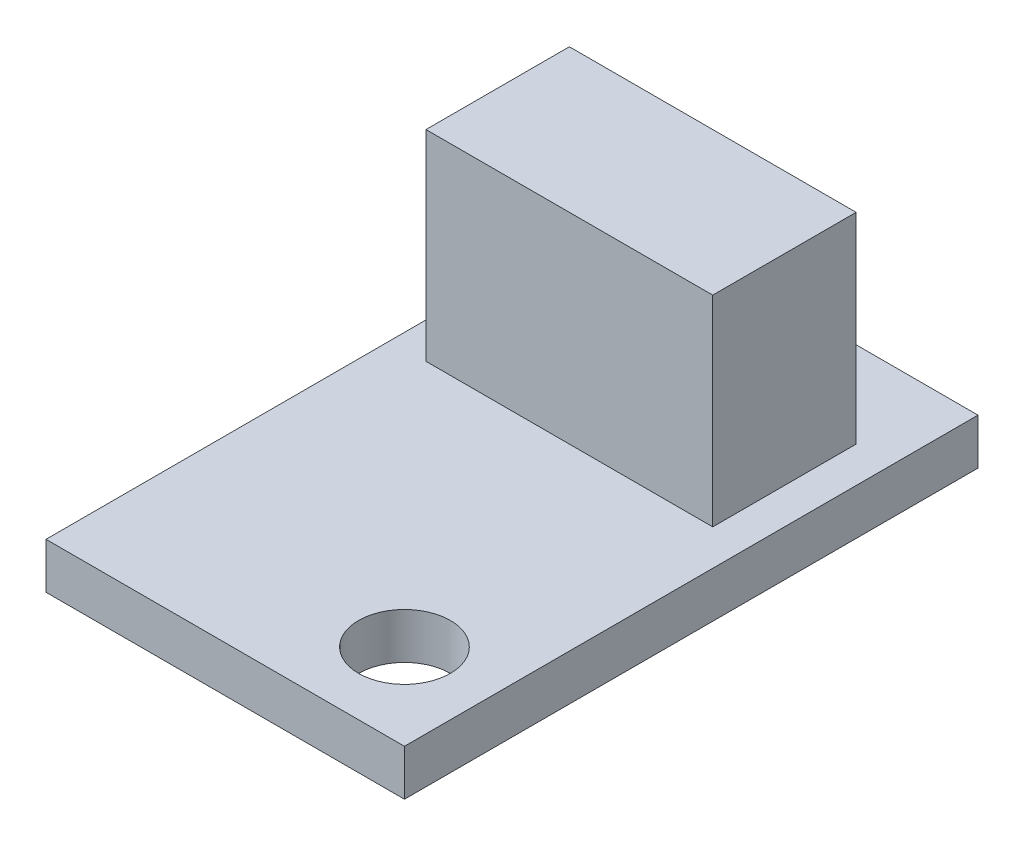
ISO-10303-21;
HEADER;
FILE_DESCRIPTION(('STEP AP214'),'2;1');
FILE_NAME('part.step','',(''),(''),'','','');
FILE_SCHEMA(('AUTOMOTIVE_DESIGN { 1 0 10303 214 1 1 1 1 }'));
ENDSEC;
DATA;
#1=APPLICATION_CONTEXT('core data for automotive mechanical design processes');
#2=APPLICATION_PROTOCOL_DEFINITION('international standard','automotive_design',2000,#1);
#3=PRODUCT_CONTEXT('',#1,'mechanical');
#4=PRODUCT('Part','Part','',(#3));
#5=PRODUCT_RELATED_PRODUCT_CATEGORY('part','',(#4));
#6=PRODUCT_DEFINITION_FORMATION('','',#4);
#7=PRODUCT_DEFINITION_CONTEXT('part definition',#1,'design');
#8=PRODUCT_DEFINITION('design','',#6,#7);
#9=PRODUCT_DEFINITION_SHAPE('','',#8);
#10=(LENGTH_UNIT() NAMED_UNIT(*) SI_UNIT(.MILLI.,.METRE.));
#11=(NAMED_UNIT(*) PLANE_ANGLE_UNIT() SI_UNIT($,.RADIAN.));
#12=(NAMED_UNIT(*) SI_UNIT($,.STERADIAN.) SOLID_ANGLE_UNIT());
#13=UNCERTAINTY_MEASURE_WITH_UNIT(LENGTH_MEASURE(1.E-05),#10,'distance_accuracy_value','');
#14=(GEOMETRIC_REPRESENTATION_CONTEXT(3) GLOBAL_UNCERTAINTY_ASSIGNED_CONTEXT((#13)) GLOBAL_UNIT_ASSIGNED_CONTEXT((#10,
#11,#12)) REPRESENTATION_CONTEXT('',''));
#15=CARTESIAN_POINT('',(0.,0.,0.));
#16=DIRECTION('',(0.,0.,1.));
#17=DIRECTION('',(1.,0.,0.));
#18=AXIS2_PLACEMENT_3D('',#15,#16,#17);
#19=CARTESIAN_POINT('',(0.,1.6,0.));
#20=DIRECTION('',(0.,-1.,0.));
#21=DIRECTION('',(0.,0.,-1.));
#22=AXIS2_PLACEMENT_3D('',#19,#20,#21);
#23=PLANE('',#22);
#24=CARTESIAN_POINT('',(3.25,1.6,-3.));
#25=DIRECTION('',(0.,1.,0.));
#26=DIRECTION('',(0.,0.,1.));
#27=AXIS2_PLACEMENT_3D('',#24,#25,#26);
#28=CIRCLE('',#27,1.6);
#29=CARTESIAN_POINT('',(3.25,1.6,-1.4));
#30=VERTEX_POINT('',#29);
#31=EDGE_CURVE('E123',#30,#30,#28,.T.);
#32=ORIENTED_EDGE('',*,*,#31,.F.);
#33=EDGE_LOOP('',(#32));
#34=FACE_BOUND('',#33,.T.);
#35=DIRECTION('',(0.,0.,1.));
#36=VECTOR('',#35,1.);
#37=CARTESIAN_POINT('',(-6.25,1.6,0.));
#38=LINE('',#37,#36);
#39=CARTESIAN_POINT('',(-6.25,1.6,-20.));
#40=VERTEX_POINT('',#39);
#41=CARTESIAN_POINT('',(-6.25,1.6,0.));
#42=VERTEX_POINT('',#41);
#43=EDGE_CURVE('E132',#40,#42,#38,.T.);
#44=ORIENTED_EDGE('',*,*,#43,.T.);
#45=DIRECTION('',(1.,0.,0.));
#46=VECTOR('',#45,1.);
#47=CARTESIAN_POINT('',(-6.25,1.6,0.));
#48=LINE('',#47,#46);
#49=CARTESIAN_POINT('',(6.25,1.6,0.));
#50=VERTEX_POINT('',#49);
#51=EDGE_CURVE('E135',#42,#50,#48,.T.);
#52=ORIENTED_EDGE('',*,*,#51,.T.);
#53=DIRECTION('',(0.,0.,-1.));
#54=VECTOR('',#53,1.);
#55=CARTESIAN_POINT('',(6.25,1.6,0.));
#56=LINE('',#55,#54);
#57=CARTESIAN_POINT('',(6.24999999999999,1.6,-20.));
#58=VERTEX_POINT('',#57);
#59=EDGE_CURVE('E138',#50,#58,#56,.T.);
#60=ORIENTED_EDGE('',*,*,#59,.T.);
#61=DIRECTION('',(-1.,0.,0.));
#62=VECTOR('',#61,1.);
#63=CARTESIAN_POINT('',(-6.25,1.6,-20.));
#64=LINE('',#63,#62);
#65=EDGE_CURVE('E140',#58,#40,#64,.T.);
#66=ORIENTED_EDGE('',*,*,#65,.T.);
#67=EDGE_LOOP('',(#44,#52,#60,#66));
#68=FACE_BOUND('',#67,.T.);
#69=DIRECTION('',(0.,0.,1.));
#70=VECTOR('',#69,1.);
#71=CARTESIAN_POINT('',(-5.,1.6,-17.));
#72=LINE('',#71,#70);
#73=CARTESIAN_POINT('',(-5.,1.6,-17.));
#74=VERTEX_POINT('',#73);
#75=CARTESIAN_POINT('',(-5.,1.6,-12.));
#76=VERTEX_POINT('',#75);
#77=EDGE_CURVE('E119',#74,#76,#72,.T.);
#78=ORIENTED_EDGE('',*,*,#77,.F.);
#79=DIRECTION('',(-1.,0.,0.));
#80=VECTOR('',#79,1.);
#81=CARTESIAN_POINT('',(-5.,1.6,-17.));
#82=LINE('',#81,#80);
#83=CARTESIAN_POINT('',(5.,1.6,-17.));
#84=VERTEX_POINT('',#83);
#85=EDGE_CURVE('E116',#84,#74,#82,.T.);
#86=ORIENTED_EDGE('',*,*,#85,.F.);
#87=DIRECTION('',(0.,0.,-1.));
#88=VECTOR('',#87,1.);
#89=CARTESIAN_POINT('',(5.,1.6,-17.));
#90=LINE('',#89,#88);
#91=CARTESIAN_POINT('',(5.,1.6,-12.));
#92=VERTEX_POINT('',#91);
#93=EDGE_CURVE('E54',#92,#84,#90,.T.);
#94=ORIENTED_EDGE('',*,*,#93,.F.);
#95=DIRECTION('',(1.,0.,0.));
#96=VECTOR('',#95,1.);
#97=CARTESIAN_POINT('',(-5.,1.6,-12.));
#98=LINE('',#97,#96);
#99=EDGE_CURVE('E49',#76,#92,#98,.T.);
#100=ORIENTED_EDGE('',*,*,#99,.F.);
#101=EDGE_LOOP('',(#78,#86,#94,#100));
#102=FACE_BOUND('',#101,.T.);
#103=ADVANCED_FACE('F34',(#34,#68,#102),#23,.F.);
#104=CARTESIAN_POINT('',(0.,0.,0.));
#105=DIRECTION('',(0.,-1.,0.));
#106=DIRECTION('',(0.,0.,-1.));
#107=AXIS2_PLACEMENT_3D('',#104,#105,#106);
#108=PLANE('',#107);
#109=DIRECTION('',(0.,0.,1.));
#110=VECTOR('',#109,1.);
#111=CARTESIAN_POINT('',(-6.25,0.,0.));
#112=LINE('',#111,#110);
#113=CARTESIAN_POINT('',(-6.25,0.,-20.));
#114=VERTEX_POINT('',#113);
#115=CARTESIAN_POINT('',(-6.25,0.,0.));
#116=VERTEX_POINT('',#115);
#117=EDGE_CURVE('E130',#114,#116,#112,.T.);
#118=ORIENTED_EDGE('',*,*,#117,.F.);
#119=DIRECTION('',(-1.,0.,0.));
#120=VECTOR('',#119,1.);
#121=CARTESIAN_POINT('',(-6.25,0.,-20.));
#122=LINE('',#121,#120);
#123=CARTESIAN_POINT('',(6.24999999999999,0.,-20.));
#124=VERTEX_POINT('',#123);
#125=EDGE_CURVE('E136',#124,#114,#122,.T.);
#126=ORIENTED_EDGE('',*,*,#125,.F.);
#127=DIRECTION('',(0.,0.,-1.));
#128=VECTOR('',#127,1.);
#129=CARTESIAN_POINT('',(6.25,0.,0.));
#130=LINE('',#129,#128);
#131=CARTESIAN_POINT('',(6.25,0.,0.));
#132=VERTEX_POINT('',#131);
#133=EDGE_CURVE('E147',#132,#124,#130,.T.);
#134=ORIENTED_EDGE('',*,*,#133,.F.);
#135=DIRECTION('',(1.,0.,0.));
#136=VECTOR('',#135,1.);
#137=CARTESIAN_POINT('',(-6.25,0.,0.));
#138=LINE('',#137,#136);
#139=EDGE_CURVE('E145',#116,#132,#138,.T.);
#140=ORIENTED_EDGE('',*,*,#139,.F.);
#141=EDGE_LOOP('',(#118,#126,#134,#140));
#142=FACE_BOUND('',#141,.T.);
#143=CARTESIAN_POINT('',(3.25,0.,-3.));
#144=DIRECTION('',(0.,1.,0.));
#145=DIRECTION('',(0.,0.,1.));
#146=AXIS2_PLACEMENT_3D('',#143,#144,#145);
#147=CIRCLE('',#146,1.6);
#148=CARTESIAN_POINT('',(3.25,0.,-1.4));
#149=VERTEX_POINT('',#148);
#150=EDGE_CURVE('E120',#149,#149,#147,.T.);
#151=ORIENTED_EDGE('',*,*,#150,.T.);
#152=EDGE_LOOP('',(#151));
#153=FACE_BOUND('',#152,.T.);
#154=ADVANCED_FACE('F165',(#142,#153),#108,.T.);
#155=CARTESIAN_POINT('',(-6.25,1.6,0.));
#156=DIRECTION('',(1.,0.,0.));
#157=DIRECTION('',(0.,0.,-1.));
#158=AXIS2_PLACEMENT_3D('',#155,#156,#157);
#159=PLANE('',#158);
#160=ORIENTED_EDGE('',*,*,#117,.T.);
#161=DIRECTION('',(0.,-1.,0.));
#162=VECTOR('',#161,1.);
#163=CARTESIAN_POINT('',(-6.25,1.6,0.));
#164=LINE('',#163,#162);
#165=EDGE_CURVE('E11',#42,#116,#164,.T.);
#166=ORIENTED_EDGE('',*,*,#165,.F.);
#167=ORIENTED_EDGE('',*,*,#43,.F.);
#168=DIRECTION('',(0.,-1.,0.));
#169=VECTOR('',#168,1.);
#170=CARTESIAN_POINT('',(-6.25,1.6,-20.));
#171=LINE('',#170,#169);
#172=EDGE_CURVE('E142',#40,#114,#171,.T.);
#173=ORIENTED_EDGE('',*,*,#172,.T.);
#174=EDGE_LOOP('',(#160,#166,#167,#173));
#175=FACE_BOUND('',#174,.T.);
#176=ADVANCED_FACE('F36',(#175),#159,.F.);
#177=CARTESIAN_POINT('',(-6.25,1.6,0.));
#178=DIRECTION('',(0.,0.,-1.));
#179=DIRECTION('',(-1.,0.,0.));
#180=AXIS2_PLACEMENT_3D('',#177,#178,#179);
#181=PLANE('',#180);
#182=ORIENTED_EDGE('',*,*,#139,.T.);
#183=DIRECTION('',(0.,-1.,0.));
#184=VECTOR('',#183,1.);
#185=CARTESIAN_POINT('',(6.25,1.6,0.));
#186=LINE('',#185,#184);
#187=EDGE_CURVE('E42',#50,#132,#186,.T.);
#188=ORIENTED_EDGE('',*,*,#187,.F.);
#189=ORIENTED_EDGE('',*,*,#51,.F.);
#190=ORIENTED_EDGE('',*,*,#165,.T.);
#191=EDGE_LOOP('',(#182,#188,#189,#190));
#192=FACE_BOUND('',#191,.T.);
#193=ADVANCED_FACE('F175',(#192),#181,.F.);
#194=CARTESIAN_POINT('',(6.25,1.6,0.));
#195=DIRECTION('',(-1.,0.,0.));
#196=DIRECTION('',(0.,0.,1.));
#197=AXIS2_PLACEMENT_3D('',#194,#195,#196);
#198=PLANE('',#197);
#199=ORIENTED_EDGE('',*,*,#133,.T.);
#200=DIRECTION('',(0.,-1.,0.));
#201=VECTOR('',#200,1.);
#202=CARTESIAN_POINT('',(6.24999999999999,1.6,-20.));
#203=LINE('',#202,#201);
#204=EDGE_CURVE('E152',#58,#124,#203,.T.);
#205=ORIENTED_EDGE('',*,*,#204,.F.);
#206=ORIENTED_EDGE('',*,*,#59,.F.);
#207=ORIENTED_EDGE('',*,*,#187,.T.);
#208=EDGE_LOOP('',(#199,#205,#206,#207));
#209=FACE_BOUND('',#208,.T.);
#210=ADVANCED_FACE('F159',(#209),#198,.F.);
#211=CARTESIAN_POINT('',(-6.25,1.6,-20.));
#212=DIRECTION('',(0.,0.,1.));
#213=DIRECTION('',(1.,0.,0.));
#214=AXIS2_PLACEMENT_3D('',#211,#212,#213);
#215=PLANE('',#214);
#216=ORIENTED_EDGE('',*,*,#125,.T.);
#217=ORIENTED_EDGE('',*,*,#172,.F.);
#218=ORIENTED_EDGE('',*,*,#65,.F.);
#219=ORIENTED_EDGE('',*,*,#204,.T.);
#220=EDGE_LOOP('',(#216,#217,#218,#219));
#221=FACE_BOUND('',#220,.T.);
#222=ADVANCED_FACE('F169',(#221),#215,.F.);
#223=CARTESIAN_POINT('',(3.25,1.6,-3.));
#224=DIRECTION('',(0.,-1.,0.));
#225=DIRECTION('',(0.,0.,-1.));
#226=AXIS2_PLACEMENT_3D('',#223,#224,#225);
#227=CYLINDRICAL_SURFACE('',#226,1.6);
#228=ORIENTED_EDGE('',*,*,#31,.T.);
#229=EDGE_LOOP('',(#228));
#230=FACE_BOUND('',#229,.T.);
#231=ORIENTED_EDGE('',*,*,#150,.F.);
#232=EDGE_LOOP('',(#231));
#233=FACE_BOUND('',#232,.T.);
#234=ADVANCED_FACE('F191',(#230,#233),#227,.F.);
#235=CARTESIAN_POINT('',(-5.,8.6,-17.));
#236=DIRECTION('',(1.,0.,0.));
#237=DIRECTION('',(0.,0.,-1.));
#238=AXIS2_PLACEMENT_3D('',#235,#236,#237);
#239=PLANE('',#238);
#240=ORIENTED_EDGE('',*,*,#77,.T.);
#241=DIRECTION('',(0.,-1.,0.));
#242=VECTOR('',#241,1.);
#243=CARTESIAN_POINT('',(-5.,8.6,-12.));
#244=LINE('',#243,#242);
#245=CARTESIAN_POINT('',(-5.,8.6,-12.));
#246=VERTEX_POINT('',#245);
#247=EDGE_CURVE('E100',#246,#76,#244,.T.);
#248=ORIENTED_EDGE('',*,*,#247,.F.);
#249=DIRECTION('',(0.,0.,1.));
#250=VECTOR('',#249,1.);
#251=CARTESIAN_POINT('',(-5.,8.6,-17.));
#252=LINE('',#251,#250);
#253=CARTESIAN_POINT('',(-5.,8.6,-17.));
#254=VERTEX_POINT('',#253);
#255=EDGE_CURVE('E107',#254,#246,#252,.T.);
#256=ORIENTED_EDGE('',*,*,#255,.F.);
#257=DIRECTION('',(0.,-1.,0.));
#258=VECTOR('',#257,1.);
#259=CARTESIAN_POINT('',(-5.,8.6,-17.));
#260=LINE('',#259,#258);
#261=EDGE_CURVE('E292',#254,#74,#260,.T.);
#262=ORIENTED_EDGE('',*,*,#261,.T.);
#263=EDGE_LOOP('',(#240,#248,#256,#262));
#264=FACE_BOUND('',#263,.T.);
#265=ADVANCED_FACE('F118',(#264),#239,.F.);
#266=CARTESIAN_POINT('',(-5.,8.6,-12.));
#267=DIRECTION('',(0.,0.,-1.));
#268=DIRECTION('',(-1.,0.,0.));
#269=AXIS2_PLACEMENT_3D('',#266,#267,#268);
#270=PLANE('',#269);
#271=ORIENTED_EDGE('',*,*,#99,.T.);
#272=DIRECTION('',(0.,-1.,0.));
#273=VECTOR('',#272,1.);
#274=CARTESIAN_POINT('',(5.,8.6,-12.));
#275=LINE('',#274,#273);
#276=CARTESIAN_POINT('',(5.,8.6,-12.));
#277=VERTEX_POINT('',#276);
#278=EDGE_CURVE('E103',#277,#92,#275,.T.);
#279=ORIENTED_EDGE('',*,*,#278,.F.);
#280=DIRECTION('',(1.,0.,0.));
#281=VECTOR('',#280,1.);
#282=CARTESIAN_POINT('',(-5.,8.6,-12.));
#283=LINE('',#282,#281);
#284=EDGE_CURVE('E96',#246,#277,#283,.T.);
#285=ORIENTED_EDGE('',*,*,#284,.F.);
#286=ORIENTED_EDGE('',*,*,#247,.T.);
#287=EDGE_LOOP('',(#271,#279,#285,#286));
#288=FACE_BOUND('',#287,.T.);
#289=ADVANCED_FACE('F98',(#288),#270,.F.);
#290=CARTESIAN_POINT('',(5.,8.6,-17.));
#291=DIRECTION('',(-1.,0.,0.));
#292=DIRECTION('',(0.,0.,1.));
#293=AXIS2_PLACEMENT_3D('',#290,#291,#292);
#294=PLANE('',#293);
#295=ORIENTED_EDGE('',*,*,#93,.T.);
#296=DIRECTION('',(0.,-1.,0.));
#297=VECTOR('',#296,1.);
#298=CARTESIAN_POINT('',(5.,8.6,-17.));
#299=LINE('',#298,#297);
#300=CARTESIAN_POINT('',(5.,8.6,-17.));
#301=VERTEX_POINT('',#300);
#302=EDGE_CURVE('E125',#301,#84,#299,.T.);
#303=ORIENTED_EDGE('',*,*,#302,.F.);
#304=DIRECTION('',(0.,0.,-1.));
#305=VECTOR('',#304,1.);
#306=CARTESIAN_POINT('',(5.,8.6,-17.));
#307=LINE('',#306,#305);
#308=EDGE_CURVE('E106',#277,#301,#307,.T.);
#309=ORIENTED_EDGE('',*,*,#308,.F.);
#310=ORIENTED_EDGE('',*,*,#278,.T.);
#311=EDGE_LOOP('',(#295,#303,#309,#310));
#312=FACE_BOUND('',#311,.T.);
#313=ADVANCED_FACE('F207',(#312),#294,.F.);
#314=CARTESIAN_POINT('',(-5.,8.6,-17.));
#315=DIRECTION('',(0.,0.,1.));
#316=DIRECTION('',(1.,0.,0.));
#317=AXIS2_PLACEMENT_3D('',#314,#315,#316);
#318=PLANE('',#317);
#319=ORIENTED_EDGE('',*,*,#85,.T.);
#320=ORIENTED_EDGE('',*,*,#261,.F.);
#321=DIRECTION('',(-1.,0.,0.));
#322=VECTOR('',#321,1.);
#323=CARTESIAN_POINT('',(-5.,8.6,-17.));
#324=LINE('',#323,#322);
#325=EDGE_CURVE('E112',#301,#254,#324,.T.);
#326=ORIENTED_EDGE('',*,*,#325,.F.);
#327=ORIENTED_EDGE('',*,*,#302,.T.);
#328=EDGE_LOOP('',(#319,#320,#326,#327));
#329=FACE_BOUND('',#328,.T.);
#330=ADVANCED_FACE('F212',(#329),#318,.F.);
#331=CARTESIAN_POINT('',(0.,8.6,0.));
#332=DIRECTION('',(0.,1.,0.));
#333=DIRECTION('',(0.,0.,1.));
#334=AXIS2_PLACEMENT_3D('',#331,#332,#333);
#335=PLANE('',#334);
#336=ORIENTED_EDGE('',*,*,#255,.T.);
#337=ORIENTED_EDGE('',*,*,#284,.T.);
#338=ORIENTED_EDGE('',*,*,#308,.T.);
#339=ORIENTED_EDGE('',*,*,#325,.T.);
#340=EDGE_LOOP('',(#336,#337,#338,#339));
#341=FACE_BOUND('',#340,.T.);
#342=ADVANCED_FACE('F110',(#341),#335,.T.);
#343=CLOSED_SHELL('',(#103,#154,#176,#193,#210,#222,#234,#265,#289,#313,#330,#342));
#344=MANIFOLD_SOLID_BREP('B2',#343);
#345=ADVANCED_BREP_SHAPE_REPRESENTATION('',(#18,#344),#14);
#346=SHAPE_DEFINITION_REPRESENTATION(#9,#345);
ENDSEC;
END-ISO-10303-21;
